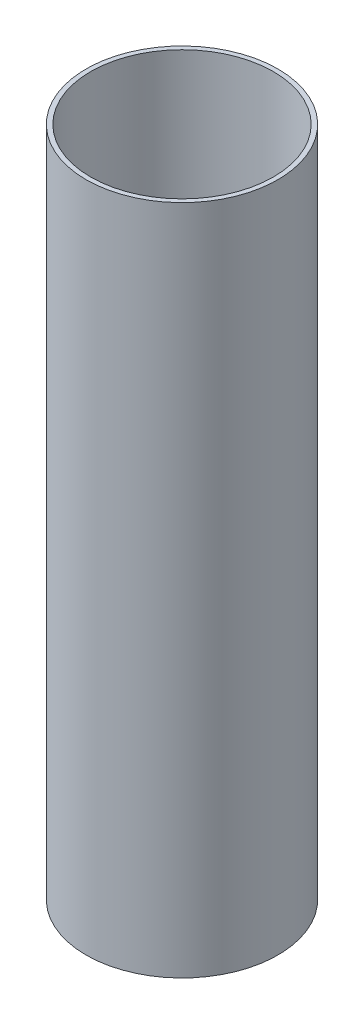
ISO-10303-21;
HEADER;
FILE_DESCRIPTION(('STEP AP214'),'2;1');
FILE_NAME('part.step','',(''),(''),'','','');
FILE_SCHEMA(('AUTOMOTIVE_DESIGN { 1 0 10303 214 1 1 1 1 }'));
ENDSEC;
DATA;
#1=APPLICATION_CONTEXT('core data for automotive mechanical design processes');
#2=APPLICATION_PROTOCOL_DEFINITION('international standard','automotive_design',2000,#1);
#3=PRODUCT_CONTEXT('',#1,'mechanical');
#4=PRODUCT('Part','Part','',(#3));
#5=PRODUCT_RELATED_PRODUCT_CATEGORY('part','',(#4));
#6=PRODUCT_DEFINITION_FORMATION('','',#4);
#7=PRODUCT_DEFINITION_CONTEXT('part definition',#1,'design');
#8=PRODUCT_DEFINITION('design','',#6,#7);
#9=PRODUCT_DEFINITION_SHAPE('','',#8);
#10=(LENGTH_UNIT() NAMED_UNIT(*) SI_UNIT(.MILLI.,.METRE.));
#11=(NAMED_UNIT(*) PLANE_ANGLE_UNIT() SI_UNIT($,.RADIAN.));
#12=(NAMED_UNIT(*) SI_UNIT($,.STERADIAN.) SOLID_ANGLE_UNIT());
#13=UNCERTAINTY_MEASURE_WITH_UNIT(LENGTH_MEASURE(1.E-05),#10,'distance_accuracy_value','');
#14=(GEOMETRIC_REPRESENTATION_CONTEXT(3) GLOBAL_UNCERTAINTY_ASSIGNED_CONTEXT((#13)) GLOBAL_UNIT_ASSIGNED_CONTEXT((#10,
#11,#12)) REPRESENTATION_CONTEXT('',''));
#15=CARTESIAN_POINT('',(0.,0.,0.));
#16=DIRECTION('',(0.,0.,1.));
#17=DIRECTION('',(1.,0.,0.));
#18=AXIS2_PLACEMENT_3D('',#15,#16,#17);
#19=CARTESIAN_POINT('',(0.,2.,0.));
#20=DIRECTION('',(0.,-1.,0.));
#21=DIRECTION('',(0.,0.,-1.));
#22=AXIS2_PLACEMENT_3D('',#19,#20,#21);
#23=CYLINDRICAL_SURFACE('',#22,21.);
#24=CARTESIAN_POINT('',(0.,0.,0.));
#25=DIRECTION('',(0.,1.,0.));
#26=DIRECTION('',(0.,0.,1.));
#27=AXIS2_PLACEMENT_3D('',#24,#25,#26);
#28=CIRCLE('',#27,21.);
#29=CARTESIAN_POINT('',(0.,0.,21.));
#30=VERTEX_POINT('',#29);
#31=EDGE_CURVE('E66',#30,#30,#28,.T.);
#32=ORIENTED_EDGE('',*,*,#31,.T.);
#33=EDGE_LOOP('',(#32));
#34=FACE_BOUND('',#33,.T.);
#35=CARTESIAN_POINT('',(0.,147.,0.));
#36=DIRECTION('',(0.,1.,0.));
#37=DIRECTION('',(0.,0.,1.));
#38=AXIS2_PLACEMENT_3D('',#35,#36,#37);
#39=CIRCLE('',#38,21.);
#40=CARTESIAN_POINT('',(0.,147.,21.));
#41=VERTEX_POINT('',#40);
#42=EDGE_CURVE('E93',#41,#41,#39,.T.);
#43=ORIENTED_EDGE('',*,*,#42,.F.);
#44=EDGE_LOOP('',(#43));
#45=FACE_BOUND('',#44,.T.);
#46=ADVANCED_FACE('F47',(#34,#45),#23,.T.);
#47=CARTESIAN_POINT('',(0.,0.,0.));
#48=DIRECTION('',(0.,1.,0.));
#49=DIRECTION('',(0.,0.,1.));
#50=AXIS2_PLACEMENT_3D('',#47,#48,#49);
#51=PLANE('',#50);
#52=CARTESIAN_POINT('',(0.,0.,0.));
#53=DIRECTION('',(0.,1.,0.));
#54=DIRECTION('',(0.,0.,1.));
#55=AXIS2_PLACEMENT_3D('',#52,#53,#54);
#56=CIRCLE('',#55,10.05);
#57=CARTESIAN_POINT('',(0.,0.,10.05));
#58=VERTEX_POINT('',#57);
#59=EDGE_CURVE('E69',#58,#58,#56,.T.);
#60=ORIENTED_EDGE('',*,*,#59,.T.);
#61=EDGE_LOOP('',(#60));
#62=FACE_BOUND('',#61,.T.);
#63=ORIENTED_EDGE('',*,*,#31,.F.);
#64=EDGE_LOOP('',(#63));
#65=FACE_BOUND('',#64,.T.);
#66=ADVANCED_FACE('F129',(#62,#65),#51,.F.);
#67=CARTESIAN_POINT('',(0.,-10.5,0.));
#68=DIRECTION('',(0.,1.,0.));
#69=DIRECTION('',(0.,0.,1.));
#70=AXIS2_PLACEMENT_3D('',#67,#68,#69);
#71=CYLINDRICAL_SURFACE('',#70,10.05);
#72=CARTESIAN_POINT('',(0.,2.,0.));
#73=DIRECTION('',(0.,1.,0.));
#74=DIRECTION('',(0.,0.,1.));
#75=AXIS2_PLACEMENT_3D('',#72,#73,#74);
#76=CIRCLE('',#75,10.05);
#77=CARTESIAN_POINT('',(0.,2.,10.05));
#78=VERTEX_POINT('',#77);
#79=EDGE_CURVE('E73',#78,#78,#76,.T.);
#80=ORIENTED_EDGE('',*,*,#79,.T.);
#81=EDGE_LOOP('',(#80));
#82=FACE_BOUND('',#81,.T.);
#83=ORIENTED_EDGE('',*,*,#59,.F.);
#84=EDGE_LOOP('',(#83));
#85=FACE_BOUND('',#84,.T.);
#86=ADVANCED_FACE('F136',(#82,#85),#71,.F.);
#87=CARTESIAN_POINT('',(0.,2.,0.));
#88=DIRECTION('',(0.,1.,0.));
#89=DIRECTION('',(0.,0.,1.));
#90=AXIS2_PLACEMENT_3D('',#87,#88,#89);
#91=CYLINDRICAL_SURFACE('',#90,20.);
#92=CARTESIAN_POINT('',(0.,27.0500000000002,0.));
#93=DIRECTION('',(0.,-1.,0.));
#94=DIRECTION('',(0.,0.,-1.));
#95=AXIS2_PLACEMENT_3D('',#92,#93,#94);
#96=CIRCLE('',#95,20.);
#97=CARTESIAN_POINT('',(0.,27.0500000000002,-20.));
#98=VERTEX_POINT('',#97);
#99=EDGE_CURVE('E56',#98,#98,#96,.F.);
#100=ORIENTED_EDGE('',*,*,#99,.T.);
#101=EDGE_LOOP('',(#100));
#102=FACE_BOUND('',#101,.T.);
#103=CARTESIAN_POINT('',(0.,2.,0.));
#104=DIRECTION('',(0.,1.,0.));
#105=DIRECTION('',(0.,0.,1.));
#106=AXIS2_PLACEMENT_3D('',#103,#104,#105);
#107=CIRCLE('',#106,20.);
#108=CARTESIAN_POINT('',(0.,2.,20.));
#109=VERTEX_POINT('',#108);
#110=EDGE_CURVE('E80',#109,#109,#107,.T.);
#111=ORIENTED_EDGE('',*,*,#110,.F.);
#112=EDGE_LOOP('',(#111));
#113=FACE_BOUND('',#112,.T.);
#114=ADVANCED_FACE('F181',(#102,#113),#91,.F.);
#115=CARTESIAN_POINT('',(0.,2.,0.));
#116=DIRECTION('',(0.,1.,0.));
#117=DIRECTION('',(0.,0.,1.));
#118=AXIS2_PLACEMENT_3D('',#115,#116,#117);
#119=PLANE('',#118);
#120=ORIENTED_EDGE('',*,*,#79,.F.);
#121=EDGE_LOOP('',(#120));
#122=FACE_BOUND('',#121,.T.);
#123=ORIENTED_EDGE('',*,*,#110,.T.);
#124=EDGE_LOOP('',(#123));
#125=FACE_BOUND('',#124,.T.);
#126=ADVANCED_FACE('F161',(#122,#125),#119,.T.);
#127=CARTESIAN_POINT('',(0.,26.,0.));
#128=DIRECTION('',(0.,1.,0.));
#129=DIRECTION('',(0.,0.,1.));
#130=AXIS2_PLACEMENT_3D('',#127,#128,#129);
#131=CYLINDRICAL_SURFACE('',#130,10.05);
#132=CARTESIAN_POINT('',(0.,37.0000000000001,0.));
#133=DIRECTION('',(0.,1.,0.));
#134=DIRECTION('',(0.,0.,1.));
#135=AXIS2_PLACEMENT_3D('',#132,#133,#134);
#136=CIRCLE('',#135,10.05);
#137=CARTESIAN_POINT('',(0.,37.0000000000001,10.05));
#138=VERTEX_POINT('',#137);
#139=EDGE_CURVE('E61',#138,#138,#136,.F.);
#140=ORIENTED_EDGE('',*,*,#139,.T.);
#141=EDGE_LOOP('',(#140));
#142=FACE_BOUND('',#141,.T.);
#143=CARTESIAN_POINT('',(0.,38.5,0.));
#144=DIRECTION('',(0.,1.,0.));
#145=DIRECTION('',(0.,0.,1.));
#146=AXIS2_PLACEMENT_3D('',#143,#144,#145);
#147=CIRCLE('',#146,10.05);
#148=CARTESIAN_POINT('',(0.,38.5,10.05));
#149=VERTEX_POINT('',#148);
#150=EDGE_CURVE('E84',#149,#149,#147,.T.);
#151=ORIENTED_EDGE('',*,*,#150,.T.);
#152=EDGE_LOOP('',(#151));
#153=FACE_BOUND('',#152,.T.);
#154=ADVANCED_FACE('F158',(#142,#153),#131,.F.);
#155=CARTESIAN_POINT('',(0.,38.5,0.));
#156=DIRECTION('',(0.,1.,0.));
#157=DIRECTION('',(0.,0.,1.));
#158=AXIS2_PLACEMENT_3D('',#155,#156,#157);
#159=CYLINDRICAL_SURFACE('',#158,20.);
#160=CARTESIAN_POINT('',(0.,38.5,0.));
#161=DIRECTION('',(0.,1.,0.));
#162=DIRECTION('',(0.,0.,1.));
#163=AXIS2_PLACEMENT_3D('',#160,#161,#162);
#164=CIRCLE('',#163,20.);
#165=CARTESIAN_POINT('',(0.,38.5,20.));
#166=VERTEX_POINT('',#165);
#167=EDGE_CURVE('E88',#166,#166,#164,.T.);
#168=ORIENTED_EDGE('',*,*,#167,.F.);
#169=EDGE_LOOP('',(#168));
#170=FACE_BOUND('',#169,.T.);
#171=CARTESIAN_POINT('',(0.,57.5,0.));
#172=DIRECTION('',(0.,1.,0.));
#173=DIRECTION('',(0.,0.,1.));
#174=AXIS2_PLACEMENT_3D('',#171,#172,#173);
#175=CIRCLE('',#174,20.);
#176=CARTESIAN_POINT('',(0.,57.5,20.));
#177=VERTEX_POINT('',#176);
#178=EDGE_CURVE('E89',#177,#177,#175,.T.);
#179=ORIENTED_EDGE('',*,*,#178,.T.);
#180=EDGE_LOOP('',(#179));
#181=FACE_BOUND('',#180,.T.);
#182=ADVANCED_FACE('F160',(#170,#181),#159,.F.);
#183=CARTESIAN_POINT('',(0.,38.5,0.));
#184=DIRECTION('',(0.,1.,0.));
#185=DIRECTION('',(0.,0.,1.));
#186=AXIS2_PLACEMENT_3D('',#183,#184,#185);
#187=PLANE('',#186);
#188=ORIENTED_EDGE('',*,*,#150,.F.);
#189=EDGE_LOOP('',(#188));
#190=FACE_BOUND('',#189,.T.);
#191=ORIENTED_EDGE('',*,*,#167,.T.);
#192=EDGE_LOOP('',(#191));
#193=FACE_BOUND('',#192,.T.);
#194=ADVANCED_FACE('F165',(#190,#193),#187,.T.);
#195=CARTESIAN_POINT('',(0.,57.5,0.));
#196=DIRECTION('',(0.,1.,0.));
#197=DIRECTION('',(0.,0.,1.));
#198=AXIS2_PLACEMENT_3D('',#195,#196,#197);
#199=CYLINDRICAL_SURFACE('',#198,7.5);
#200=CARTESIAN_POINT('',(0.,70.,0.));
#201=DIRECTION('',(0.,1.,0.));
#202=DIRECTION('',(0.,0.,1.));
#203=AXIS2_PLACEMENT_3D('',#200,#201,#202);
#204=CIRCLE('',#203,7.5);
#205=CARTESIAN_POINT('',(0.,70.,7.5));
#206=VERTEX_POINT('',#205);
#207=EDGE_CURVE('E10',#206,#206,#204,.F.);
#208=CARTESIAN_POINT('',(0.,72.,0.));
#209=DIRECTION('',(0.,1.,0.));
#210=DIRECTION('',(0.,0.,1.));
#211=AXIS2_PLACEMENT_3D('',#208,#209,#210);
#212=CIRCLE('',#211,7.5);
#213=CARTESIAN_POINT('',(0.,72.,7.5));
#214=VERTEX_POINT('',#213);
#215=EDGE_CURVE('E97',#214,#214,#212,.T.);
#216=CARTESIAN_POINT('',(0.,70.,7.5));
#217=CARTESIAN_POINT('',(0.,70.0208333333334,7.5));
#218=CARTESIAN_POINT('',(0.,70.0416666666667,7.5));
#219=CARTESIAN_POINT('',(0.,70.0833333333333,7.5));
#220=CARTESIAN_POINT('',(0.,70.1041666666667,7.5));
#221=CARTESIAN_POINT('',(0.,70.1458333333334,7.5));
#222=CARTESIAN_POINT('',(0.,70.1666666666667,7.5));
#223=CARTESIAN_POINT('',(0.,70.2083333333333,7.5));
#224=CARTESIAN_POINT('',(0.,70.2291666666667,7.5));
#225=CARTESIAN_POINT('',(0.,70.2708333333333,7.5));
#226=CARTESIAN_POINT('',(0.,70.2916666666667,7.5));
#227=CARTESIAN_POINT('',(0.,70.3333333333333,7.5));
#228=CARTESIAN_POINT('',(0.,70.3541666666667,7.5));
#229=CARTESIAN_POINT('',(0.,70.3958333333333,7.5));
#230=CARTESIAN_POINT('',(0.,70.4166666666667,7.5));
#231=CARTESIAN_POINT('',(0.,70.4583333333333,7.5));
#232=CARTESIAN_POINT('',(0.,70.4791666666667,7.5));
#233=CARTESIAN_POINT('',(0.,70.5208333333333,7.5));
#234=CARTESIAN_POINT('',(0.,70.5416666666667,7.5));
#235=CARTESIAN_POINT('',(0.,70.5833333333333,7.5));
#236=CARTESIAN_POINT('',(0.,70.6041666666667,7.5));
#237=CARTESIAN_POINT('',(0.,70.6458333333333,7.5));
#238=CARTESIAN_POINT('',(0.,70.6666666666667,7.5));
#239=CARTESIAN_POINT('',(0.,70.7083333333333,7.5));
#240=CARTESIAN_POINT('',(0.,70.7291666666667,7.5));
#241=CARTESIAN_POINT('',(0.,70.7708333333333,7.5));
#242=CARTESIAN_POINT('',(0.,70.7916666666667,7.5));
#243=CARTESIAN_POINT('',(0.,70.8333333333333,7.5));
#244=CARTESIAN_POINT('',(0.,70.8541666666667,7.5));
#245=CARTESIAN_POINT('',(0.,70.8958333333333,7.5));
#246=CARTESIAN_POINT('',(0.,70.9166666666667,7.5));
#247=CARTESIAN_POINT('',(0.,70.9583333333333,7.5));
#248=CARTESIAN_POINT('',(0.,70.9791666666667,7.5));
#249=CARTESIAN_POINT('',(0.,71.0208333333333,7.5));
#250=CARTESIAN_POINT('',(0.,71.0416666666667,7.5));
#251=CARTESIAN_POINT('',(0.,71.0833333333333,7.5));
#252=CARTESIAN_POINT('',(0.,71.1041666666667,7.5));
#253=CARTESIAN_POINT('',(0.,71.1458333333333,7.5));
#254=CARTESIAN_POINT('',(0.,71.1666666666667,7.5));
#255=CARTESIAN_POINT('',(0.,71.2083333333333,7.5));
#256=CARTESIAN_POINT('',(0.,71.2291666666667,7.5));
#257=CARTESIAN_POINT('',(0.,71.2708333333333,7.5));
#258=CARTESIAN_POINT('',(0.,71.2916666666667,7.5));
#259=CARTESIAN_POINT('',(0.,71.3333333333333,7.5));
#260=CARTESIAN_POINT('',(0.,71.3541666666667,7.5));
#261=CARTESIAN_POINT('',(0.,71.3958333333333,7.5));
#262=CARTESIAN_POINT('',(0.,71.4166666666667,7.5));
#263=CARTESIAN_POINT('',(0.,71.4583333333333,7.5));
#264=CARTESIAN_POINT('',(0.,71.4791666666667,7.5));
#265=CARTESIAN_POINT('',(0.,71.5208333333333,7.5));
#266=CARTESIAN_POINT('',(0.,71.5416666666667,7.5));
#267=CARTESIAN_POINT('',(0.,71.5833333333333,7.5));
#268=CARTESIAN_POINT('',(0.,71.6041666666667,7.5));
#269=CARTESIAN_POINT('',(0.,71.6458333333333,7.5));
#270=CARTESIAN_POINT('',(0.,71.6666666666667,7.5));
#271=CARTESIAN_POINT('',(0.,71.7083333333333,7.5));
#272=CARTESIAN_POINT('',(0.,71.7291666666667,7.5));
#273=CARTESIAN_POINT('',(0.,71.7708333333333,7.5));
#274=CARTESIAN_POINT('',(0.,71.7916666666667,7.5));
#275=CARTESIAN_POINT('',(0.,71.8333333333333,7.5));
#276=CARTESIAN_POINT('',(0.,71.8541666666667,7.5));
#277=CARTESIAN_POINT('',(0.,71.8958333333333,7.5));
#278=CARTESIAN_POINT('',(0.,71.9166666666667,7.5));
#279=CARTESIAN_POINT('',(0.,71.9583333333333,7.5));
#280=CARTESIAN_POINT('',(0.,71.9791666666667,7.5));
#281=CARTESIAN_POINT('',(0.,72.,7.5));
#282=B_SPLINE_CURVE_WITH_KNOTS('',3,(#216,#217,#218,#219,#220,#221,#222,#223,#224,#225,#226,
#227,#228,#229,#230,#231,#232,#233,#234,#235,#236,#237,#238,#239,#240,#241,#242,#243,#244,#245,
#246,#247,#248,#249,#250,#251,#252,#253,#254,#255,#256,#257,#258,#259,#260,#261,#262,#263,#264,
#265,#266,#267,#268,#269,#270,#271,#272,#273,#274,#275,#276,#277,#278,#279,#280,#281),
.UNSPECIFIED.,.F.,.F.,(4,2,2,2,2,2,2,2,2,2,2,2,2,2,2,2,2,2,2,2,2,2,2,2,2,2,2,2,2,2,2,2,4),(0.,
0.0624999999999931,0.125,0.187499999999993,0.249999999999986,0.312499999999993,
0.374999999999986,0.437499999999993,0.499999999999987,0.562499999999994,0.624999999999987,
0.687499999999994,0.749999999999987,0.812499999999994,0.874999999999987,0.937499999999994,
0.999999999999987,1.06249999999998,1.12499999999999,1.18749999999998,1.24999999999999,
1.31249999999998,1.37499999999999,1.43749999999998,1.49999999999999,1.56249999999998,
1.62499999999999,1.68749999999998,1.74999999999999,1.81249999999998,1.87499999999997,
1.93749999999998,1.99999999999997),.UNSPECIFIED.);
#283=EDGE_CURVE('BSEAM124',#206,#214,#282,.T.);
#284=ORIENTED_EDGE('',*,*,#207,.T.);
#285=ORIENTED_EDGE('',*,*,#215,.T.);
#286=ORIENTED_EDGE('',*,*,#283,.T.);
#287=ORIENTED_EDGE('',*,*,#283,.F.);
#288=EDGE_LOOP('',(#284,#286,#285,#287));
#289=FACE_BOUND('',#288,.T.);
#290=ADVANCED_FACE('F124',(#289),#199,.F.);
#291=CARTESIAN_POINT('',(0.,147.,0.));
#292=DIRECTION('',(0.,1.,0.));
#293=DIRECTION('',(0.,0.,1.));
#294=AXIS2_PLACEMENT_3D('',#291,#292,#293);
#295=PLANE('',#294);
#296=CARTESIAN_POINT('',(0.,147.,0.));
#297=DIRECTION('',(0.,1.,0.));
#298=DIRECTION('',(0.,0.,1.));
#299=AXIS2_PLACEMENT_3D('',#296,#297,#298);
#300=CIRCLE('',#299,20.);
#301=CARTESIAN_POINT('',(0.,147.,20.));
#302=VERTEX_POINT('',#301);
#303=EDGE_CURVE('E105',#302,#302,#300,.T.);
#304=ORIENTED_EDGE('',*,*,#303,.F.);
#305=EDGE_LOOP('',(#304));
#306=FACE_BOUND('',#305,.T.);
#307=ORIENTED_EDGE('',*,*,#42,.T.);
#308=EDGE_LOOP('',(#307));
#309=FACE_BOUND('',#308,.T.);
#310=ADVANCED_FACE('F118',(#306,#309),#295,.T.);
#311=CARTESIAN_POINT('',(0.,72.,0.));
#312=DIRECTION('',(0.,1.,0.));
#313=DIRECTION('',(0.,0.,1.));
#314=AXIS2_PLACEMENT_3D('',#311,#312,#313);
#315=CYLINDRICAL_SURFACE('',#314,20.);
#316=CARTESIAN_POINT('',(0.,72.,0.));
#317=DIRECTION('',(0.,1.,0.));
#318=DIRECTION('',(0.,0.,1.));
#319=AXIS2_PLACEMENT_3D('',#316,#317,#318);
#320=CIRCLE('',#319,20.);
#321=CARTESIAN_POINT('',(0.,72.,20.));
#322=VERTEX_POINT('',#321);
#323=EDGE_CURVE('E101',#322,#322,#320,.T.);
#324=ORIENTED_EDGE('',*,*,#323,.F.);
#325=EDGE_LOOP('',(#324));
#326=FACE_BOUND('',#325,.T.);
#327=ORIENTED_EDGE('',*,*,#303,.T.);
#328=EDGE_LOOP('',(#327));
#329=FACE_BOUND('',#328,.T.);
#330=ADVANCED_FACE('F115',(#326,#329),#315,.F.);
#331=CARTESIAN_POINT('',(0.,72.,0.));
#332=DIRECTION('',(0.,1.,0.));
#333=DIRECTION('',(0.,0.,1.));
#334=AXIS2_PLACEMENT_3D('',#331,#332,#333);
#335=PLANE('',#334);
#336=ORIENTED_EDGE('',*,*,#215,.F.);
#337=EDGE_LOOP('',(#336));
#338=FACE_BOUND('',#337,.T.);
#339=ORIENTED_EDGE('',*,*,#323,.T.);
#340=EDGE_LOOP('',(#339));
#341=FACE_BOUND('',#340,.T.);
#342=ADVANCED_FACE('F113',(#338,#341),#335,.T.);
#343=CARTESIAN_POINT('',(0.,26.,0.));
#344=DIRECTION('',(0.,-1.,0.));
#345=DIRECTION('',(0.,0.,-1.));
#346=AXIS2_PLACEMENT_3D('',#343,#344,#345);
#347=CONICAL_SURFACE('',#346,21.0500000000002,0.785398163397454);
#348=ORIENTED_EDGE('',*,*,#139,.F.);
#349=EDGE_LOOP('',(#348));
#350=FACE_BOUND('',#349,.T.);
#351=ORIENTED_EDGE('',*,*,#99,.F.);
#352=EDGE_LOOP('',(#351));
#353=FACE_BOUND('',#352,.T.);
#354=ADVANCED_FACE('F141',(#350,#353),#347,.F.);
#355=CARTESIAN_POINT('',(0.,57.5,0.));
#356=DIRECTION('',(0.,-1.,0.));
#357=DIRECTION('',(0.,0.,-1.));
#358=AXIS2_PLACEMENT_3D('',#355,#356,#357);
#359=CONICAL_SURFACE('',#358,20.,0.785398163397446);
#360=ORIENTED_EDGE('',*,*,#207,.F.);
#361=EDGE_LOOP('',(#360));
#362=FACE_BOUND('',#361,.T.);
#363=ORIENTED_EDGE('',*,*,#178,.F.);
#364=EDGE_LOOP('',(#363));
#365=FACE_BOUND('',#364,.T.);
#366=ADVANCED_FACE('F50',(#362,#365),#359,.F.);
#367=CLOSED_SHELL('',(#46,#66,#86,#114,#126,#154,#182,#194,#290,#310,#330,#342,#354,#366));
#368=MANIFOLD_SOLID_BREP('B2',#367);
#369=ADVANCED_BREP_SHAPE_REPRESENTATION('',(#18,#368),#14);
#370=SHAPE_DEFINITION_REPRESENTATION(#9,#369);
ENDSEC;
END-ISO-10303-21;
